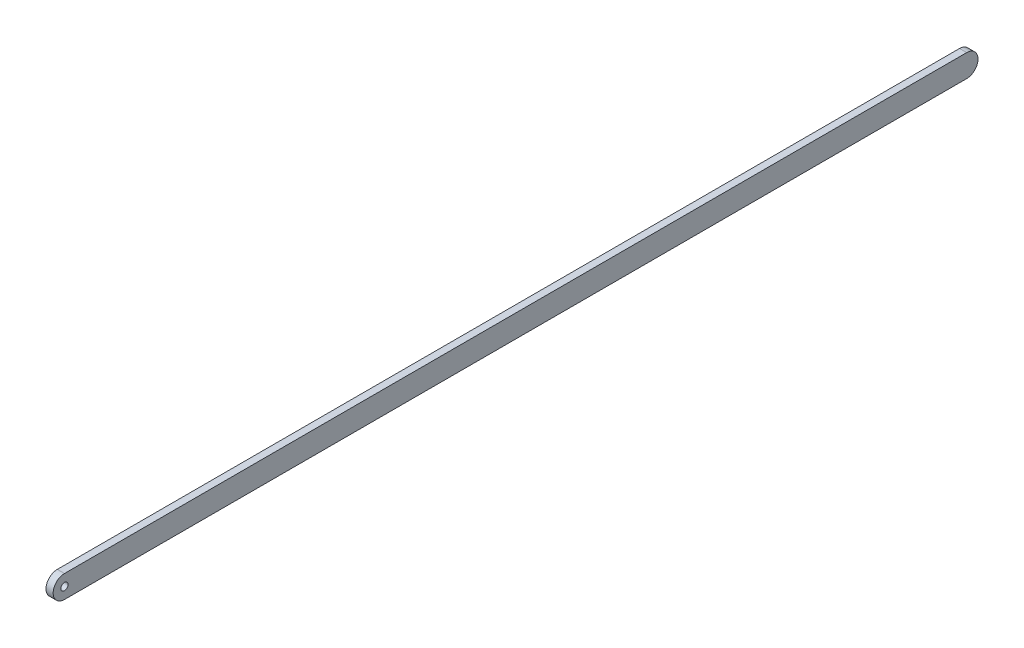
ISO-10303-21;
HEADER;
FILE_DESCRIPTION(('STEP AP214'),'2;1');
FILE_NAME('part.step','',(''),(''),'','','');
FILE_SCHEMA(('AUTOMOTIVE_DESIGN { 1 0 10303 214 1 1 1 1 }'));
ENDSEC;
DATA;
#1=APPLICATION_CONTEXT('core data for automotive mechanical design processes');
#2=APPLICATION_PROTOCOL_DEFINITION('international standard','automotive_design',2000,#1);
#3=PRODUCT_CONTEXT('',#1,'mechanical');
#4=PRODUCT('Part','Part','',(#3));
#5=PRODUCT_RELATED_PRODUCT_CATEGORY('part','',(#4));
#6=PRODUCT_DEFINITION_FORMATION('','',#4);
#7=PRODUCT_DEFINITION_CONTEXT('part definition',#1,'design');
#8=PRODUCT_DEFINITION('design','',#6,#7);
#9=PRODUCT_DEFINITION_SHAPE('','',#8);
#10=(LENGTH_UNIT() NAMED_UNIT(*) SI_UNIT(.MILLI.,.METRE.));
#11=(NAMED_UNIT(*) PLANE_ANGLE_UNIT() SI_UNIT($,.RADIAN.));
#12=(NAMED_UNIT(*) SI_UNIT($,.STERADIAN.) SOLID_ANGLE_UNIT());
#13=UNCERTAINTY_MEASURE_WITH_UNIT(LENGTH_MEASURE(1.E-05),#10,'distance_accuracy_value','');
#14=(GEOMETRIC_REPRESENTATION_CONTEXT(3) GLOBAL_UNCERTAINTY_ASSIGNED_CONTEXT((#13)) GLOBAL_UNIT_ASSIGNED_CONTEXT((#10,
#11,#12)) REPRESENTATION_CONTEXT('',''));
#15=CARTESIAN_POINT('',(0.,0.,0.));
#16=DIRECTION('',(0.,0.,1.));
#17=DIRECTION('',(1.,0.,0.));
#18=AXIS2_PLACEMENT_3D('',#15,#16,#17);
#19=CARTESIAN_POINT('',(3.175,0.,200.));
#20=DIRECTION('',(-1.,0.,0.));
#21=DIRECTION('',(0.,0.,1.));
#22=AXIS2_PLACEMENT_3D('',#19,#20,#21);
#23=CYLINDRICAL_SURFACE('',#22,5.00000000000001);
#24=CARTESIAN_POINT('',(0.,0.,200.));
#25=DIRECTION('',(1.,0.,0.));
#26=DIRECTION('',(0.,0.,-1.));
#27=AXIS2_PLACEMENT_3D('',#24,#25,#26);
#28=CIRCLE('',#27,5.00000000000001);
#29=CARTESIAN_POINT('',(0.,5.,200.));
#30=VERTEX_POINT('',#29);
#31=CARTESIAN_POINT('',(0.,-5.00000000000001,200.));
#32=VERTEX_POINT('',#31);
#33=EDGE_CURVE('E98',#30,#32,#28,.T.);
#34=ORIENTED_EDGE('',*,*,#33,.T.);
#35=DIRECTION('',(-1.,0.,0.));
#36=VECTOR('',#35,1.);
#37=CARTESIAN_POINT('',(3.175,-5.00000000000001,200.));
#38=LINE('',#37,#36);
#39=CARTESIAN_POINT('',(3.175,-5.00000000000001,200.));
#40=VERTEX_POINT('',#39);
#41=EDGE_CURVE('E11',#40,#32,#38,.T.);
#42=ORIENTED_EDGE('',*,*,#41,.F.);
#43=CARTESIAN_POINT('',(3.175,0.,200.));
#44=DIRECTION('',(1.,0.,0.));
#45=DIRECTION('',(0.,0.,-1.));
#46=AXIS2_PLACEMENT_3D('',#43,#44,#45);
#47=CIRCLE('',#46,5.00000000000001);
#48=CARTESIAN_POINT('',(3.175,5.,200.));
#49=VERTEX_POINT('',#48);
#50=EDGE_CURVE('E85',#49,#40,#47,.T.);
#51=ORIENTED_EDGE('',*,*,#50,.F.);
#52=DIRECTION('',(-1.,0.,0.));
#53=VECTOR('',#52,1.);
#54=CARTESIAN_POINT('',(3.175,5.,200.));
#55=LINE('',#54,#53);
#56=EDGE_CURVE('E94',#49,#30,#55,.T.);
#57=ORIENTED_EDGE('',*,*,#56,.T.);
#58=EDGE_LOOP('',(#34,#42,#51,#57));
#59=FACE_BOUND('',#58,.T.);
#60=ADVANCED_FACE('F33',(#59),#23,.T.);
#61=CARTESIAN_POINT('',(3.175,-5.00000000000001,200.));
#62=DIRECTION('',(0.,1.,0.));
#63=DIRECTION('',(0.,0.,1.));
#64=AXIS2_PLACEMENT_3D('',#61,#62,#63);
#65=PLANE('',#64);
#66=DIRECTION('',(0.,0.,-1.));
#67=VECTOR('',#66,1.);
#68=CARTESIAN_POINT('',(0.,-5.00000000000001,200.));
#69=LINE('',#68,#67);
#70=CARTESIAN_POINT('',(0.,-5.00000000000001,-200.));
#71=VERTEX_POINT('',#70);
#72=EDGE_CURVE('E89',#32,#71,#69,.T.);
#73=ORIENTED_EDGE('',*,*,#72,.T.);
#74=DIRECTION('',(-1.,0.,0.));
#75=VECTOR('',#74,1.);
#76=CARTESIAN_POINT('',(3.175,-5.00000000000001,-200.));
#77=LINE('',#76,#75);
#78=CARTESIAN_POINT('',(3.175,-5.00000000000001,-200.));
#79=VERTEX_POINT('',#78);
#80=EDGE_CURVE('E42',#79,#71,#77,.T.);
#81=ORIENTED_EDGE('',*,*,#80,.F.);
#82=DIRECTION('',(0.,0.,-1.));
#83=VECTOR('',#82,1.);
#84=CARTESIAN_POINT('',(3.175,-5.00000000000001,200.));
#85=LINE('',#84,#83);
#86=EDGE_CURVE('E80',#40,#79,#85,.T.);
#87=ORIENTED_EDGE('',*,*,#86,.F.);
#88=ORIENTED_EDGE('',*,*,#41,.T.);
#89=EDGE_LOOP('',(#73,#81,#87,#88));
#90=FACE_BOUND('',#89,.T.);
#91=ADVANCED_FACE('F88',(#90),#65,.F.);
#92=CARTESIAN_POINT('',(3.175,0.,-200.));
#93=DIRECTION('',(-1.,0.,0.));
#94=DIRECTION('',(0.,0.,1.));
#95=AXIS2_PLACEMENT_3D('',#92,#93,#94);
#96=CYLINDRICAL_SURFACE('',#95,5.00000000000001);
#97=CARTESIAN_POINT('',(0.,0.,-200.));
#98=DIRECTION('',(1.,0.,0.));
#99=DIRECTION('',(0.,0.,-1.));
#100=AXIS2_PLACEMENT_3D('',#97,#98,#99);
#101=CIRCLE('',#100,5.00000000000001);
#102=CARTESIAN_POINT('',(0.,5.,-200.));
#103=VERTEX_POINT('',#102);
#104=EDGE_CURVE('E67',#71,#103,#101,.T.);
#105=ORIENTED_EDGE('',*,*,#104,.T.);
#106=DIRECTION('',(-1.,0.,0.));
#107=VECTOR('',#106,1.);
#108=CARTESIAN_POINT('',(3.175,5.,-200.));
#109=LINE('',#108,#107);
#110=CARTESIAN_POINT('',(3.175,5.,-200.));
#111=VERTEX_POINT('',#110);
#112=EDGE_CURVE('E90',#111,#103,#109,.T.);
#113=ORIENTED_EDGE('',*,*,#112,.F.);
#114=CARTESIAN_POINT('',(3.175,0.,-200.));
#115=DIRECTION('',(1.,0.,0.));
#116=DIRECTION('',(0.,0.,-1.));
#117=AXIS2_PLACEMENT_3D('',#114,#115,#116);
#118=CIRCLE('',#117,5.00000000000001);
#119=EDGE_CURVE('E83',#79,#111,#118,.T.);
#120=ORIENTED_EDGE('',*,*,#119,.F.);
#121=ORIENTED_EDGE('',*,*,#80,.T.);
#122=EDGE_LOOP('',(#105,#113,#120,#121));
#123=FACE_BOUND('',#122,.T.);
#124=ADVANCED_FACE('F92',(#123),#96,.T.);
#125=CARTESIAN_POINT('',(3.175,5.,200.));
#126=DIRECTION('',(0.,-1.,0.));
#127=DIRECTION('',(0.,0.,-1.));
#128=AXIS2_PLACEMENT_3D('',#125,#126,#127);
#129=PLANE('',#128);
#130=DIRECTION('',(0.,0.,1.));
#131=VECTOR('',#130,1.);
#132=CARTESIAN_POINT('',(0.,5.,200.));
#133=LINE('',#132,#131);
#134=EDGE_CURVE('E73',#103,#30,#133,.T.);
#135=ORIENTED_EDGE('',*,*,#134,.T.);
#136=ORIENTED_EDGE('',*,*,#56,.F.);
#137=DIRECTION('',(0.,0.,1.));
#138=VECTOR('',#137,1.);
#139=CARTESIAN_POINT('',(3.175,5.,200.));
#140=LINE('',#139,#138);
#141=EDGE_CURVE('E50',#111,#49,#140,.T.);
#142=ORIENTED_EDGE('',*,*,#141,.F.);
#143=ORIENTED_EDGE('',*,*,#112,.T.);
#144=EDGE_LOOP('',(#135,#136,#142,#143));
#145=FACE_BOUND('',#144,.T.);
#146=ADVANCED_FACE('F105',(#145),#129,.F.);
#147=CARTESIAN_POINT('',(3.175,0.,200.));
#148=DIRECTION('',(1.,0.,0.));
#149=DIRECTION('',(0.,0.,-1.));
#150=AXIS2_PLACEMENT_3D('',#147,#148,#149);
#151=PLANE('',#150);
#152=CARTESIAN_POINT('',(3.175,0.,200.));
#153=DIRECTION('',(1.,0.,0.));
#154=DIRECTION('',(0.,0.,-1.));
#155=AXIS2_PLACEMENT_3D('',#152,#153,#154);
#156=CIRCLE('',#155,1.59999999999999);
#157=CARTESIAN_POINT('',(3.175,0.,198.4));
#158=VERTEX_POINT('',#157);
#159=EDGE_CURVE('E114',#158,#158,#156,.T.);
#160=ORIENTED_EDGE('',*,*,#159,.F.);
#161=EDGE_LOOP('',(#160));
#162=FACE_BOUND('',#161,.T.);
#163=ORIENTED_EDGE('',*,*,#50,.T.);
#164=ORIENTED_EDGE('',*,*,#86,.T.);
#165=ORIENTED_EDGE('',*,*,#119,.T.);
#166=ORIENTED_EDGE('',*,*,#141,.T.);
#167=EDGE_LOOP('',(#163,#164,#165,#166));
#168=FACE_BOUND('',#167,.T.);
#169=ADVANCED_FACE('F81',(#162,#168),#151,.T.);
#170=CARTESIAN_POINT('',(0.,0.,200.));
#171=DIRECTION('',(1.,0.,0.));
#172=DIRECTION('',(0.,0.,-1.));
#173=AXIS2_PLACEMENT_3D('',#170,#171,#172);
#174=PLANE('',#173);
#175=CARTESIAN_POINT('',(0.,0.,200.));
#176=DIRECTION('',(1.,0.,0.));
#177=DIRECTION('',(0.,0.,-1.));
#178=AXIS2_PLACEMENT_3D('',#175,#176,#177);
#179=CIRCLE('',#178,1.37303057293918);
#180=CARTESIAN_POINT('',(0.,0.,198.626969427061));
#181=VERTEX_POINT('',#180);
#182=EDGE_CURVE('E36',#181,#181,#179,.T.);
#183=ORIENTED_EDGE('',*,*,#182,.T.);
#184=EDGE_LOOP('',(#183));
#185=FACE_BOUND('',#184,.T.);
#186=ORIENTED_EDGE('',*,*,#33,.F.);
#187=ORIENTED_EDGE('',*,*,#134,.F.);
#188=ORIENTED_EDGE('',*,*,#104,.F.);
#189=ORIENTED_EDGE('',*,*,#72,.F.);
#190=EDGE_LOOP('',(#186,#187,#188,#189));
#191=FACE_BOUND('',#190,.T.);
#192=ADVANCED_FACE('F108',(#185,#191),#174,.F.);
#193=CARTESIAN_POINT('',(0.136376990444096,0.,200.));
#194=DIRECTION('',(1.,0.,0.));
#195=DIRECTION('',(0.,0.,-1.));
#196=AXIS2_PLACEMENT_3D('',#193,#194,#195);
#197=CONICAL_SURFACE('',#196,1.6,1.02974425867665);
#198=CARTESIAN_POINT('',(0.136376990444096,0.,200.));
#199=DIRECTION('',(1.,0.,0.));
#200=DIRECTION('',(0.,0.,-1.));
#201=AXIS2_PLACEMENT_3D('',#198,#199,#200);
#202=CIRCLE('',#201,1.6);
#203=CARTESIAN_POINT('',(0.136376990444096,0.,198.4));
#204=VERTEX_POINT('',#203);
#205=EDGE_CURVE('E111',#204,#204,#202,.T.);
#206=ORIENTED_EDGE('',*,*,#205,.T.);
#207=EDGE_LOOP('',(#206));
#208=FACE_BOUND('',#207,.T.);
#209=ORIENTED_EDGE('',*,*,#182,.F.);
#210=EDGE_LOOP('',(#209));
#211=FACE_BOUND('',#210,.T.);
#212=ADVANCED_FACE('F126',(#208,#211),#197,.F.);
#213=CARTESIAN_POINT('',(3.175,0.,200.));
#214=DIRECTION('',(1.,0.,0.));
#215=DIRECTION('',(0.,0.,-1.));
#216=AXIS2_PLACEMENT_3D('',#213,#214,#215);
#217=CYLINDRICAL_SURFACE('',#216,1.59999999999999);
#218=ORIENTED_EDGE('',*,*,#205,.F.);
#219=EDGE_LOOP('',(#218));
#220=FACE_BOUND('',#219,.T.);
#221=ORIENTED_EDGE('',*,*,#159,.T.);
#222=EDGE_LOOP('',(#221));
#223=FACE_BOUND('',#222,.T.);
#224=ADVANCED_FACE('F118',(#220,#223),#217,.F.);
#225=CLOSED_SHELL('',(#60,#91,#124,#146,#169,#192,#212,#224));
#226=MANIFOLD_SOLID_BREP('B2',#225);
#227=ADVANCED_BREP_SHAPE_REPRESENTATION('',(#18,#226),#14);
#228=SHAPE_DEFINITION_REPRESENTATION(#9,#227);
ENDSEC;
END-ISO-10303-21;
